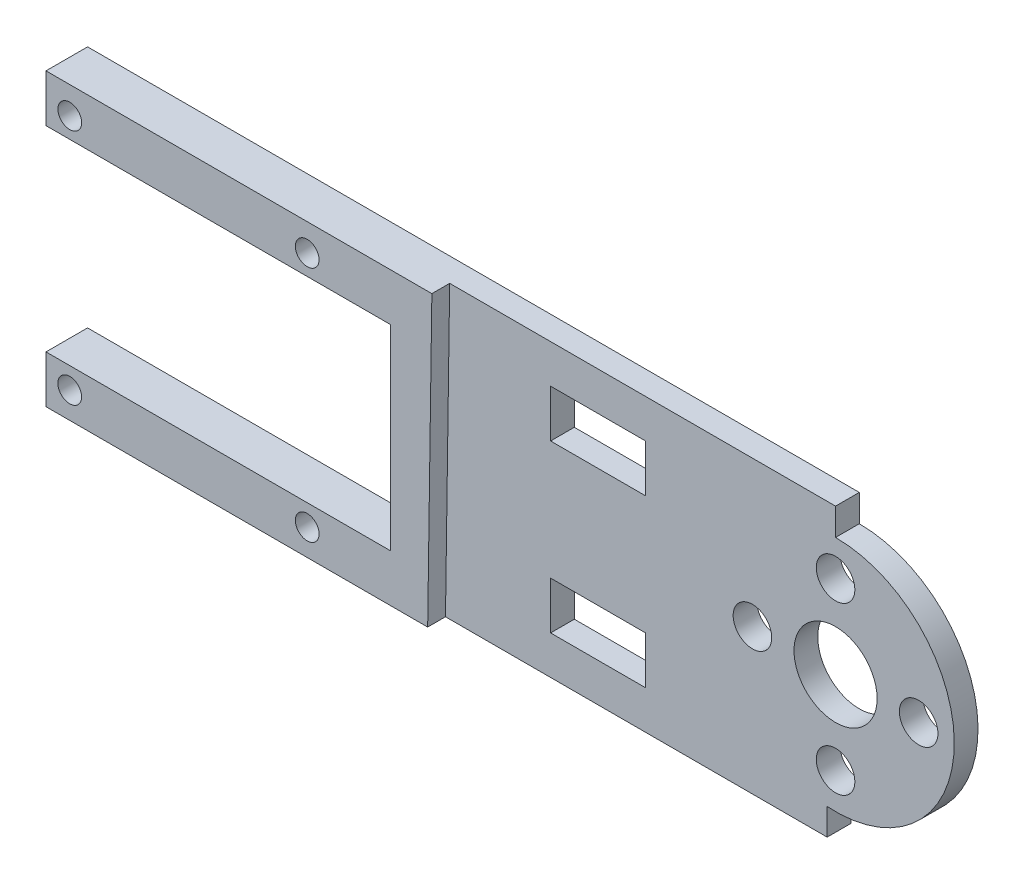
ISO-10303-21;
HEADER;
FILE_DESCRIPTION(('STEP AP214'),'2;1');
FILE_NAME('part.step','',(''),(''),'','','');
FILE_SCHEMA(('AUTOMOTIVE_DESIGN { 1 0 10303 214 1 1 1 1 }'));
ENDSEC;
DATA;
#1=APPLICATION_CONTEXT('core data for automotive mechanical design processes');
#2=APPLICATION_PROTOCOL_DEFINITION('international standard','automotive_design',2000,#1);
#3=PRODUCT_CONTEXT('',#1,'mechanical');
#4=PRODUCT('Part','Part','',(#3));
#5=PRODUCT_RELATED_PRODUCT_CATEGORY('part','',(#4));
#6=PRODUCT_DEFINITION_FORMATION('','',#4);
#7=PRODUCT_DEFINITION_CONTEXT('part definition',#1,'design');
#8=PRODUCT_DEFINITION('design','',#6,#7);
#9=PRODUCT_DEFINITION_SHAPE('','',#8);
#10=(LENGTH_UNIT() NAMED_UNIT(*) SI_UNIT(.MILLI.,.METRE.));
#11=(NAMED_UNIT(*) PLANE_ANGLE_UNIT() SI_UNIT($,.RADIAN.));
#12=(NAMED_UNIT(*) SI_UNIT($,.STERADIAN.) SOLID_ANGLE_UNIT());
#13=UNCERTAINTY_MEASURE_WITH_UNIT(LENGTH_MEASURE(1.E-05),#10,'distance_accuracy_value','');
#14=(GEOMETRIC_REPRESENTATION_CONTEXT(3) GLOBAL_UNCERTAINTY_ASSIGNED_CONTEXT((#13)) GLOBAL_UNIT_ASSIGNED_CONTEXT((#10,
#11,#12)) REPRESENTATION_CONTEXT('',''));
#15=CARTESIAN_POINT('',(0.,0.,0.));
#16=DIRECTION('',(0.,0.,1.));
#17=DIRECTION('',(1.,0.,0.));
#18=AXIS2_PLACEMENT_3D('',#15,#16,#17);
#19=CARTESIAN_POINT('',(40.1664390840958,-0.0357831339647865,2.));
#20=DIRECTION('',(0.,0.,1.));
#21=DIRECTION('',(1.,0.,0.));
#22=AXIS2_PLACEMENT_3D('',#19,#20,#21);
#23=PLANE('',#22);
#24=DIRECTION('',(0.0144240277608696,0.99989596830028,0.));
#25=VECTOR('',#24,1.);
#26=CARTESIAN_POINT('',(7.66643908409581,12.25,2.));
#27=LINE('',#26,#25);
#28=CARTESIAN_POINT('',(7.31301363650447,-12.25,2.));
#29=VERTEX_POINT('',#28);
#30=CARTESIAN_POINT('',(7.66643908409581,12.25,2.));
#31=VERTEX_POINT('',#30);
#32=EDGE_CURVE('E64',#29,#31,#27,.T.);
#33=ORIENTED_EDGE('',*,*,#32,.F.);
#34=DIRECTION('',(1.,0.,0.));
#35=VECTOR('',#34,1.);
#36=CARTESIAN_POINT('',(39.4595881889131,-12.25,2.));
#37=LINE('',#36,#35);
#38=CARTESIAN_POINT('',(39.4595881889131,-12.25,2.));
#39=VERTEX_POINT('',#38);
#40=EDGE_CURVE('E404',#29,#39,#37,.T.);
#41=ORIENTED_EDGE('',*,*,#40,.T.);
#42=DIRECTION('',(0.,1.,0.));
#43=VECTOR('',#42,1.);
#44=CARTESIAN_POINT('',(39.4595881889131,-10.0107699415741,2.));
#45=LINE('',#44,#43);
#46=CARTESIAN_POINT('',(39.4595881889131,-10.0107699415741,2.));
#47=VERTEX_POINT('',#46);
#48=EDGE_CURVE('E407',#39,#47,#45,.T.);
#49=ORIENTED_EDGE('',*,*,#48,.T.);
#50=CARTESIAN_POINT('',(40.1664390840958,-0.0357831339647865,2.));
#51=DIRECTION('',(0.,0.,1.));
#52=DIRECTION('',(1.,0.,0.));
#53=AXIS2_PLACEMENT_3D('',#50,#51,#52);
#54=CIRCLE('',#53,10.);
#55=CARTESIAN_POINT('',(40.1664390840958,9.96421686603521,2.));
#56=VERTEX_POINT('',#55);
#57=EDGE_CURVE('E413',#47,#56,#54,.T.);
#58=ORIENTED_EDGE('',*,*,#57,.T.);
#59=DIRECTION('',(0.,1.,0.));
#60=VECTOR('',#59,1.);
#61=CARTESIAN_POINT('',(40.1664390840958,12.25,2.));
#62=LINE('',#61,#60);
#63=CARTESIAN_POINT('',(40.1664390840958,12.25,2.));
#64=VERTEX_POINT('',#63);
#65=EDGE_CURVE('E415',#56,#64,#62,.T.);
#66=ORIENTED_EDGE('',*,*,#65,.T.);
#67=DIRECTION('',(-1.,0.,0.));
#68=VECTOR('',#67,1.);
#69=CARTESIAN_POINT('',(5.16643908409581,12.25,2.));
#70=LINE('',#69,#68);
#71=EDGE_CURVE('E417',#64,#31,#70,.T.);
#72=ORIENTED_EDGE('',*,*,#71,.T.);
#73=EDGE_LOOP('',(#33,#41,#49,#58,#66,#72));
#74=FACE_BOUND('',#73,.T.);
#75=CARTESIAN_POINT('',(40.1664390840958,-7.03578313396479,2.));
#76=DIRECTION('',(0.,0.,1.));
#77=DIRECTION('',(1.,0.,0.));
#78=AXIS2_PLACEMENT_3D('',#75,#76,#77);
#79=CIRCLE('',#78,1.625);
#80=CARTESIAN_POINT('',(41.7914390840958,-7.03578313396479,2.));
#81=VERTEX_POINT('',#80);
#82=EDGE_CURVE('E298',#81,#81,#79,.T.);
#83=ORIENTED_EDGE('',*,*,#82,.F.);
#84=EDGE_LOOP('',(#83));
#85=FACE_BOUND('',#84,.T.);
#86=DIRECTION('',(-1.,0.,0.));
#87=VECTOR('',#86,1.);
#88=CARTESIAN_POINT('',(16.1664710949383,9.,2.));
#89=LINE('',#88,#87);
#90=CARTESIAN_POINT('',(24.1664710949383,9.,2.));
#91=VERTEX_POINT('',#90);
#92=CARTESIAN_POINT('',(16.1664710949383,9.,2.));
#93=VERTEX_POINT('',#92);
#94=EDGE_CURVE('E318',#91,#93,#89,.T.);
#95=ORIENTED_EDGE('',*,*,#94,.F.);
#96=DIRECTION('',(0.,1.,0.));
#97=VECTOR('',#96,1.);
#98=CARTESIAN_POINT('',(24.1664710949383,9.,2.));
#99=LINE('',#98,#97);
#100=CARTESIAN_POINT('',(24.1664710949383,5.,2.));
#101=VERTEX_POINT('',#100);
#102=EDGE_CURVE('E312',#101,#91,#99,.T.);
#103=ORIENTED_EDGE('',*,*,#102,.F.);
#104=DIRECTION('',(1.,0.,0.));
#105=VECTOR('',#104,1.);
#106=CARTESIAN_POINT('',(16.1664710949383,5.,2.));
#107=LINE('',#106,#105);
#108=CARTESIAN_POINT('',(16.1664710949383,5.,2.));
#109=VERTEX_POINT('',#108);
#110=EDGE_CURVE('E326',#109,#101,#107,.T.);
#111=ORIENTED_EDGE('',*,*,#110,.F.);
#112=DIRECTION('',(0.,-1.,0.));
#113=VECTOR('',#112,1.);
#114=CARTESIAN_POINT('',(16.1664710949383,9.,2.));
#115=LINE('',#114,#113);
#116=EDGE_CURVE('E325',#93,#109,#115,.T.);
#117=ORIENTED_EDGE('',*,*,#116,.F.);
#118=EDGE_LOOP('',(#95,#103,#111,#117));
#119=FACE_BOUND('',#118,.T.);
#120=CARTESIAN_POINT('',(40.1664390840958,6.96421686603521,2.));
#121=DIRECTION('',(0.,0.,1.));
#122=DIRECTION('',(1.,0.,0.));
#123=AXIS2_PLACEMENT_3D('',#120,#121,#122);
#124=CIRCLE('',#123,1.625);
#125=CARTESIAN_POINT('',(41.7914390840958,6.96421686603521,2.));
#126=VERTEX_POINT('',#125);
#127=EDGE_CURVE('E357',#126,#126,#124,.T.);
#128=ORIENTED_EDGE('',*,*,#127,.F.);
#129=EDGE_LOOP('',(#128));
#130=FACE_BOUND('',#129,.T.);
#131=CARTESIAN_POINT('',(40.1664390840958,-0.0357831339647865,2.));
#132=DIRECTION('',(0.,0.,1.));
#133=DIRECTION('',(1.,0.,0.));
#134=AXIS2_PLACEMENT_3D('',#131,#132,#133);
#135=CIRCLE('',#134,3.5);
#136=CARTESIAN_POINT('',(43.6664390840958,-0.0357831339647865,2.));
#137=VERTEX_POINT('',#136);
#138=EDGE_CURVE('E368',#137,#137,#135,.T.);
#139=ORIENTED_EDGE('',*,*,#138,.F.);
#140=EDGE_LOOP('',(#139));
#141=FACE_BOUND('',#140,.T.);
#142=CARTESIAN_POINT('',(47.1664390840958,-0.0357831339647882,2.));
#143=DIRECTION('',(0.,0.,1.));
#144=DIRECTION('',(1.,0.,0.));
#145=AXIS2_PLACEMENT_3D('',#142,#143,#144);
#146=CIRCLE('',#145,1.625);
#147=CARTESIAN_POINT('',(48.7914390840958,-0.0357831339647882,2.));
#148=VERTEX_POINT('',#147);
#149=EDGE_CURVE('E307',#148,#148,#146,.T.);
#150=ORIENTED_EDGE('',*,*,#149,.F.);
#151=EDGE_LOOP('',(#150));
#152=FACE_BOUND('',#151,.T.);
#153=CARTESIAN_POINT('',(33.1664390840958,-0.0357831339647839,2.));
#154=DIRECTION('',(0.,0.,1.));
#155=DIRECTION('',(1.,0.,0.));
#156=AXIS2_PLACEMENT_3D('',#153,#154,#155);
#157=CIRCLE('',#156,1.625);
#158=CARTESIAN_POINT('',(34.7914390840958,-0.0357831339647839,2.));
#159=VERTEX_POINT('',#158);
#160=EDGE_CURVE('E292',#159,#159,#157,.T.);
#161=ORIENTED_EDGE('',*,*,#160,.F.);
#162=EDGE_LOOP('',(#161));
#163=FACE_BOUND('',#162,.T.);
#164=DIRECTION('',(-1.,0.,0.));
#165=VECTOR('',#164,1.);
#166=CARTESIAN_POINT('',(16.1664710949383,-5.,2.));
#167=LINE('',#166,#165);
#168=CARTESIAN_POINT('',(24.1664710949383,-5.,2.));
#169=VERTEX_POINT('',#168);
#170=CARTESIAN_POINT('',(16.1664710949383,-5.,2.));
#171=VERTEX_POINT('',#170);
#172=EDGE_CURVE('E253',#169,#171,#167,.T.);
#173=ORIENTED_EDGE('',*,*,#172,.F.);
#174=DIRECTION('',(0.,1.,0.));
#175=VECTOR('',#174,1.);
#176=CARTESIAN_POINT('',(24.1664710949383,-5.,2.));
#177=LINE('',#176,#175);
#178=CARTESIAN_POINT('',(24.1664710949383,-9.,2.));
#179=VERTEX_POINT('',#178);
#180=EDGE_CURVE('E247',#179,#169,#177,.T.);
#181=ORIENTED_EDGE('',*,*,#180,.F.);
#182=DIRECTION('',(1.,0.,0.));
#183=VECTOR('',#182,1.);
#184=CARTESIAN_POINT('',(16.1664710949383,-9.,2.));
#185=LINE('',#184,#183);
#186=CARTESIAN_POINT('',(16.1664710949383,-9.,2.));
#187=VERTEX_POINT('',#186);
#188=EDGE_CURVE('E256',#187,#179,#185,.T.);
#189=ORIENTED_EDGE('',*,*,#188,.F.);
#190=DIRECTION('',(0.,-1.,0.));
#191=VECTOR('',#190,1.);
#192=CARTESIAN_POINT('',(16.1664710949383,-5.,2.));
#193=LINE('',#192,#191);
#194=EDGE_CURVE('E254',#171,#187,#193,.T.);
#195=ORIENTED_EDGE('',*,*,#194,.F.);
#196=EDGE_LOOP('',(#173,#181,#189,#195));
#197=FACE_BOUND('',#196,.T.);
#198=ADVANCED_FACE('F44',(#74,#85,#119,#130,#141,#152,#163,#197),#23,.T.);
#199=CARTESIAN_POINT('',(40.1664390840958,-0.0357831339647865,0.));
#200=DIRECTION('',(0.,0.,1.));
#201=DIRECTION('',(1.,0.,0.));
#202=AXIS2_PLACEMENT_3D('',#199,#200,#201);
#203=PLANE('',#202);
#204=CARTESIAN_POINT('',(33.1664390840958,-0.0357831339647839,0.));
#205=DIRECTION('',(0.,0.,1.));
#206=DIRECTION('',(1.,0.,0.));
#207=AXIS2_PLACEMENT_3D('',#204,#205,#206);
#208=CIRCLE('',#207,1.625);
#209=CARTESIAN_POINT('',(34.7914390840958,-0.0357831339647839,0.));
#210=VERTEX_POINT('',#209);
#211=EDGE_CURVE('E286',#210,#210,#208,.T.);
#212=ORIENTED_EDGE('',*,*,#211,.T.);
#213=EDGE_LOOP('',(#212));
#214=FACE_BOUND('',#213,.T.);
#215=CARTESIAN_POINT('',(40.1664390840958,-7.03578313396479,0.));
#216=DIRECTION('',(0.,0.,1.));
#217=DIRECTION('',(1.,0.,0.));
#218=AXIS2_PLACEMENT_3D('',#215,#216,#217);
#219=CIRCLE('',#218,1.625);
#220=CARTESIAN_POINT('',(41.7914390840958,-7.03578313396479,0.));
#221=VERTEX_POINT('',#220);
#222=EDGE_CURVE('E293',#221,#221,#219,.T.);
#223=ORIENTED_EDGE('',*,*,#222,.T.);
#224=EDGE_LOOP('',(#223));
#225=FACE_BOUND('',#224,.T.);
#226=CARTESIAN_POINT('',(47.1664390840958,-0.0357831339647882,0.));
#227=DIRECTION('',(0.,0.,1.));
#228=DIRECTION('',(1.,0.,0.));
#229=AXIS2_PLACEMENT_3D('',#226,#227,#228);
#230=CIRCLE('',#229,1.625);
#231=CARTESIAN_POINT('',(48.7914390840958,-0.0357831339647882,0.));
#232=VERTEX_POINT('',#231);
#233=EDGE_CURVE('E302',#232,#232,#230,.T.);
#234=ORIENTED_EDGE('',*,*,#233,.T.);
#235=EDGE_LOOP('',(#234));
#236=FACE_BOUND('',#235,.T.);
#237=DIRECTION('',(0.,1.,0.));
#238=VECTOR('',#237,1.);
#239=CARTESIAN_POINT('',(24.1664710949383,9.,0.));
#240=LINE('',#239,#238);
#241=CARTESIAN_POINT('',(24.1664710949383,5.,0.));
#242=VERTEX_POINT('',#241);
#243=CARTESIAN_POINT('',(24.1664710949383,9.,0.));
#244=VERTEX_POINT('',#243);
#245=EDGE_CURVE('E313',#242,#244,#240,.T.);
#246=ORIENTED_EDGE('',*,*,#245,.T.);
#247=DIRECTION('',(-1.,0.,0.));
#248=VECTOR('',#247,1.);
#249=CARTESIAN_POINT('',(16.1664710949383,9.,0.));
#250=LINE('',#249,#248);
#251=CARTESIAN_POINT('',(16.1664710949383,9.,0.));
#252=VERTEX_POINT('',#251);
#253=EDGE_CURVE('E334',#244,#252,#250,.T.);
#254=ORIENTED_EDGE('',*,*,#253,.T.);
#255=DIRECTION('',(0.,-1.,0.));
#256=VECTOR('',#255,1.);
#257=CARTESIAN_POINT('',(16.1664710949383,9.,0.));
#258=LINE('',#257,#256);
#259=CARTESIAN_POINT('',(16.1664710949383,5.,0.));
#260=VERTEX_POINT('',#259);
#261=EDGE_CURVE('E337',#252,#260,#258,.T.);
#262=ORIENTED_EDGE('',*,*,#261,.T.);
#263=DIRECTION('',(1.,0.,0.));
#264=VECTOR('',#263,1.);
#265=CARTESIAN_POINT('',(16.1664710949383,5.,0.));
#266=LINE('',#265,#264);
#267=EDGE_CURVE('E317',#260,#242,#266,.T.);
#268=ORIENTED_EDGE('',*,*,#267,.T.);
#269=EDGE_LOOP('',(#246,#254,#262,#268));
#270=FACE_BOUND('',#269,.T.);
#271=DIRECTION('',(0.,1.,0.));
#272=VECTOR('',#271,1.);
#273=CARTESIAN_POINT('',(39.4595881889131,-10.0107699415741,0.));
#274=LINE('',#273,#272);
#275=CARTESIAN_POINT('',(39.4595881889131,-12.25,0.));
#276=VERTEX_POINT('',#275);
#277=CARTESIAN_POINT('',(39.4595881889131,-10.0107699415741,0.));
#278=VERTEX_POINT('',#277);
#279=EDGE_CURVE('E401',#276,#278,#274,.T.);
#280=ORIENTED_EDGE('',*,*,#279,.F.);
#281=DIRECTION('',(1.,0.,0.));
#282=VECTOR('',#281,1.);
#283=CARTESIAN_POINT('',(-4.83356091590419,-12.25,0.));
#284=LINE('',#283,#282);
#285=CARTESIAN_POINT('',(-24.8335609159042,-12.25,0.));
#286=VERTEX_POINT('',#285);
#287=EDGE_CURVE('E409',#286,#276,#284,.T.);
#288=ORIENTED_EDGE('',*,*,#287,.F.);
#289=DIRECTION('',(0.,-1.,0.));
#290=VECTOR('',#289,1.);
#291=CARTESIAN_POINT('',(-24.8335609159042,-8.25,0.));
#292=LINE('',#291,#290);
#293=CARTESIAN_POINT('',(-24.8335609159042,-8.25,0.));
#294=VERTEX_POINT('',#293);
#295=EDGE_CURVE('E441',#294,#286,#292,.T.);
#296=ORIENTED_EDGE('',*,*,#295,.F.);
#297=DIRECTION('',(-1.,0.,0.));
#298=VECTOR('',#297,1.);
#299=CARTESIAN_POINT('',(4.16643908409582,-8.25,0.));
#300=LINE('',#299,#298);
#301=CARTESIAN_POINT('',(4.16643908409582,-8.25,0.));
#302=VERTEX_POINT('',#301);
#303=EDGE_CURVE('E442',#302,#294,#300,.T.);
#304=ORIENTED_EDGE('',*,*,#303,.F.);
#305=DIRECTION('',(0.,-1.,0.));
#306=VECTOR('',#305,1.);
#307=CARTESIAN_POINT('',(4.16643908409582,8.25,0.));
#308=LINE('',#307,#306);
#309=CARTESIAN_POINT('',(4.16643908409582,8.25,0.));
#310=VERTEX_POINT('',#309);
#311=EDGE_CURVE('E437',#310,#302,#308,.T.);
#312=ORIENTED_EDGE('',*,*,#311,.F.);
#313=DIRECTION('',(1.,0.,0.));
#314=VECTOR('',#313,1.);
#315=CARTESIAN_POINT('',(-24.8335609159042,8.24999999999999,0.));
#316=LINE('',#315,#314);
#317=CARTESIAN_POINT('',(-24.8335609159042,8.24999999999999,0.));
#318=VERTEX_POINT('',#317);
#319=EDGE_CURVE('E434',#318,#310,#316,.T.);
#320=ORIENTED_EDGE('',*,*,#319,.F.);
#321=DIRECTION('',(0.,-1.,0.));
#322=VECTOR('',#321,1.);
#323=CARTESIAN_POINT('',(-24.8335609159042,12.25,0.));
#324=LINE('',#323,#322);
#325=CARTESIAN_POINT('',(-24.8335609159042,12.25,0.));
#326=VERTEX_POINT('',#325);
#327=EDGE_CURVE('E194',#326,#318,#324,.T.);
#328=ORIENTED_EDGE('',*,*,#327,.F.);
#329=DIRECTION('',(-1.,0.,0.));
#330=VECTOR('',#329,1.);
#331=CARTESIAN_POINT('',(-4.83356091590419,12.25,0.));
#332=LINE('',#331,#330);
#333=CARTESIAN_POINT('',(40.1664390840958,12.25,0.));
#334=VERTEX_POINT('',#333);
#335=EDGE_CURVE('E429',#334,#326,#332,.T.);
#336=ORIENTED_EDGE('',*,*,#335,.F.);
#337=DIRECTION('',(0.,1.,0.));
#338=VECTOR('',#337,1.);
#339=CARTESIAN_POINT('',(40.1664390840958,12.25,0.));
#340=LINE('',#339,#338);
#341=CARTESIAN_POINT('',(40.1664390840958,9.96421686603521,0.));
#342=VERTEX_POINT('',#341);
#343=EDGE_CURVE('E426',#342,#334,#340,.T.);
#344=ORIENTED_EDGE('',*,*,#343,.F.);
#345=CARTESIAN_POINT('',(40.1664390840958,-0.0357831339647865,0.));
#346=DIRECTION('',(0.,0.,1.));
#347=DIRECTION('',(1.,0.,0.));
#348=AXIS2_PLACEMENT_3D('',#345,#346,#347);
#349=CIRCLE('',#348,10.);
#350=EDGE_CURVE('E421',#278,#342,#349,.T.);
#351=ORIENTED_EDGE('',*,*,#350,.F.);
#352=EDGE_LOOP('',(#280,#288,#296,#304,#312,#320,#328,#336,#344,#351));
#353=FACE_BOUND('',#352,.T.);
#354=CARTESIAN_POINT('',(-2.83356091590418,9.96421686603521,0.));
#355=DIRECTION('',(0.,0.,1.));
#356=DIRECTION('',(1.,0.,0.));
#357=AXIS2_PLACEMENT_3D('',#354,#355,#356);
#358=CIRCLE('',#357,1.125);
#359=CARTESIAN_POINT('',(-1.70856091590418,9.96421686603521,0.));
#360=VERTEX_POINT('',#359);
#361=EDGE_CURVE('E398',#360,#360,#358,.T.);
#362=ORIENTED_EDGE('',*,*,#361,.T.);
#363=EDGE_LOOP('',(#362));
#364=FACE_BOUND('',#363,.T.);
#365=CARTESIAN_POINT('',(-2.83356091590418,-10.0357831339648,0.));
#366=DIRECTION('',(0.,0.,1.));
#367=DIRECTION('',(1.,0.,0.));
#368=AXIS2_PLACEMENT_3D('',#365,#366,#367);
#369=CIRCLE('',#368,1.125);
#370=CARTESIAN_POINT('',(-1.70856091590418,-10.0357831339648,0.));
#371=VERTEX_POINT('',#370);
#372=EDGE_CURVE('E386',#371,#371,#369,.T.);
#373=ORIENTED_EDGE('',*,*,#372,.T.);
#374=EDGE_LOOP('',(#373));
#375=FACE_BOUND('',#374,.T.);
#376=CARTESIAN_POINT('',(-22.8335609159042,9.96421686603521,0.));
#377=DIRECTION('',(0.,0.,1.));
#378=DIRECTION('',(1.,0.,0.));
#379=AXIS2_PLACEMENT_3D('',#376,#377,#378);
#380=CIRCLE('',#379,1.125);
#381=CARTESIAN_POINT('',(-21.7085609159042,9.96421686603521,0.));
#382=VERTEX_POINT('',#381);
#383=EDGE_CURVE('E381',#382,#382,#380,.T.);
#384=ORIENTED_EDGE('',*,*,#383,.T.);
#385=EDGE_LOOP('',(#384));
#386=FACE_BOUND('',#385,.T.);
#387=CARTESIAN_POINT('',(-22.8335609159042,-10.0357831339648,0.));
#388=DIRECTION('',(0.,0.,1.));
#389=DIRECTION('',(1.,0.,0.));
#390=AXIS2_PLACEMENT_3D('',#387,#388,#389);
#391=CIRCLE('',#390,1.125);
#392=CARTESIAN_POINT('',(-21.7085609159042,-10.0357831339648,0.));
#393=VERTEX_POINT('',#392);
#394=EDGE_CURVE('E367',#393,#393,#391,.T.);
#395=ORIENTED_EDGE('',*,*,#394,.T.);
#396=EDGE_LOOP('',(#395));
#397=FACE_BOUND('',#396,.T.);
#398=CARTESIAN_POINT('',(40.1664390840958,-0.0357831339647865,0.));
#399=DIRECTION('',(0.,0.,1.));
#400=DIRECTION('',(1.,0.,0.));
#401=AXIS2_PLACEMENT_3D('',#398,#399,#400);
#402=CIRCLE('',#401,3.5);
#403=CARTESIAN_POINT('',(43.6664390840958,-0.0357831339647865,0.));
#404=VERTEX_POINT('',#403);
#405=EDGE_CURVE('E362',#404,#404,#402,.T.);
#406=ORIENTED_EDGE('',*,*,#405,.T.);
#407=EDGE_LOOP('',(#406));
#408=FACE_BOUND('',#407,.T.);
#409=CARTESIAN_POINT('',(40.1664390840958,6.96421686603521,0.));
#410=DIRECTION('',(0.,0.,1.));
#411=DIRECTION('',(1.,0.,0.));
#412=AXIS2_PLACEMENT_3D('',#409,#410,#411);
#413=CIRCLE('',#412,1.625);
#414=CARTESIAN_POINT('',(41.7914390840958,6.96421686603521,0.));
#415=VERTEX_POINT('',#414);
#416=EDGE_CURVE('E359',#415,#415,#413,.T.);
#417=ORIENTED_EDGE('',*,*,#416,.T.);
#418=EDGE_LOOP('',(#417));
#419=FACE_BOUND('',#418,.T.);
#420=DIRECTION('',(0.,1.,0.));
#421=VECTOR('',#420,1.);
#422=CARTESIAN_POINT('',(24.1664710949383,-5.,0.));
#423=LINE('',#422,#421);
#424=CARTESIAN_POINT('',(24.1664710949383,-9.,0.));
#425=VERTEX_POINT('',#424);
#426=CARTESIAN_POINT('',(24.1664710949383,-5.,0.));
#427=VERTEX_POINT('',#426);
#428=EDGE_CURVE('E265',#425,#427,#423,.T.);
#429=ORIENTED_EDGE('',*,*,#428,.T.);
#430=DIRECTION('',(-1.,0.,0.));
#431=VECTOR('',#430,1.);
#432=CARTESIAN_POINT('',(16.1664710949383,-5.,0.));
#433=LINE('',#432,#431);
#434=CARTESIAN_POINT('',(16.1664710949383,-5.,0.));
#435=VERTEX_POINT('',#434);
#436=EDGE_CURVE('E266',#427,#435,#433,.T.);
#437=ORIENTED_EDGE('',*,*,#436,.T.);
#438=DIRECTION('',(0.,-1.,0.));
#439=VECTOR('',#438,1.);
#440=CARTESIAN_POINT('',(16.1664710949383,-5.,0.));
#441=LINE('',#440,#439);
#442=CARTESIAN_POINT('',(16.1664710949383,-9.,0.));
#443=VERTEX_POINT('',#442);
#444=EDGE_CURVE('E271',#435,#443,#441,.T.);
#445=ORIENTED_EDGE('',*,*,#444,.T.);
#446=DIRECTION('',(1.,0.,0.));
#447=VECTOR('',#446,1.);
#448=CARTESIAN_POINT('',(16.1664710949383,-9.,0.));
#449=LINE('',#448,#447);
#450=EDGE_CURVE('E252',#443,#425,#449,.T.);
#451=ORIENTED_EDGE('',*,*,#450,.T.);
#452=EDGE_LOOP('',(#429,#437,#445,#451));
#453=FACE_BOUND('',#452,.T.);
#454=ADVANCED_FACE('F515',(#214,#225,#236,#270,#353,#364,#375,#386,#397,#408,#419,#453),#203,.F.);
#455=CARTESIAN_POINT('',(39.4595881889131,-10.0107699415741,2.));
#456=DIRECTION('',(-1.,0.,0.));
#457=DIRECTION('',(0.,0.,1.));
#458=AXIS2_PLACEMENT_3D('',#455,#456,#457);
#459=PLANE('',#458);
#460=ORIENTED_EDGE('',*,*,#279,.T.);
#461=DIRECTION('',(0.,0.,-1.));
#462=VECTOR('',#461,1.);
#463=CARTESIAN_POINT('',(39.4595881889131,-10.0107699415741,2.));
#464=LINE('',#463,#462);
#465=EDGE_CURVE('E54',#47,#278,#464,.T.);
#466=ORIENTED_EDGE('',*,*,#465,.F.);
#467=ORIENTED_EDGE('',*,*,#48,.F.);
#468=DIRECTION('',(0.,0.,-1.));
#469=VECTOR('',#468,1.);
#470=CARTESIAN_POINT('',(39.4595881889131,-12.25,2.));
#471=LINE('',#470,#469);
#472=EDGE_CURVE('E11',#39,#276,#471,.T.);
#473=ORIENTED_EDGE('',*,*,#472,.T.);
#474=EDGE_LOOP('',(#460,#466,#467,#473));
#475=FACE_BOUND('',#474,.T.);
#476=ADVANCED_FACE('F50',(#475),#459,.F.);
#477=CARTESIAN_POINT('',(40.1664390840958,-0.0357831339647865,2.));
#478=DIRECTION('',(0.,0.,-1.));
#479=DIRECTION('',(-1.,0.,0.));
#480=AXIS2_PLACEMENT_3D('',#477,#478,#479);
#481=CYLINDRICAL_SURFACE('',#480,10.);
#482=ORIENTED_EDGE('',*,*,#350,.T.);
#483=DIRECTION('',(0.,0.,-1.));
#484=VECTOR('',#483,1.);
#485=CARTESIAN_POINT('',(40.1664390840958,9.96421686603521,2.));
#486=LINE('',#485,#484);
#487=EDGE_CURVE('E470',#56,#342,#486,.T.);
#488=ORIENTED_EDGE('',*,*,#487,.F.);
#489=ORIENTED_EDGE('',*,*,#57,.F.);
#490=ORIENTED_EDGE('',*,*,#465,.T.);
#491=EDGE_LOOP('',(#482,#488,#489,#490));
#492=FACE_BOUND('',#491,.T.);
#493=ADVANCED_FACE('F582',(#492),#481,.T.);
#494=CARTESIAN_POINT('',(40.1664390840958,12.25,2.));
#495=DIRECTION('',(-1.,0.,0.));
#496=DIRECTION('',(0.,0.,1.));
#497=AXIS2_PLACEMENT_3D('',#494,#495,#496);
#498=PLANE('',#497);
#499=ORIENTED_EDGE('',*,*,#343,.T.);
#500=DIRECTION('',(0.,0.,-1.));
#501=VECTOR('',#500,1.);
#502=CARTESIAN_POINT('',(40.1664390840958,12.25,2.));
#503=LINE('',#502,#501);
#504=EDGE_CURVE('E465',#64,#334,#503,.T.);
#505=ORIENTED_EDGE('',*,*,#504,.F.);
#506=ORIENTED_EDGE('',*,*,#65,.F.);
#507=ORIENTED_EDGE('',*,*,#487,.T.);
#508=EDGE_LOOP('',(#499,#505,#506,#507));
#509=FACE_BOUND('',#508,.T.);
#510=ADVANCED_FACE('F580',(#509),#498,.F.);
#511=CARTESIAN_POINT('',(-4.83356091590419,12.25,2.));
#512=DIRECTION('',(0.,-1.,0.));
#513=DIRECTION('',(1.,0.,0.));
#514=AXIS2_PLACEMENT_3D('',#511,#512,#513);
#515=PLANE('',#514);
#516=ORIENTED_EDGE('',*,*,#335,.T.);
#517=DIRECTION('',(0.,0.,-1.));
#518=VECTOR('',#517,1.);
#519=CARTESIAN_POINT('',(-24.8335609159042,12.25,2.));
#520=LINE('',#519,#518);
#521=CARTESIAN_POINT('',(-24.8335609159042,12.25,3.5));
#522=VERTEX_POINT('',#521);
#523=EDGE_CURVE('E198',#522,#326,#520,.T.);
#524=ORIENTED_EDGE('',*,*,#523,.F.);
#525=DIRECTION('',(-1.,0.,0.));
#526=VECTOR('',#525,1.);
#527=CARTESIAN_POINT('',(-24.8335609159042,12.25,3.5));
#528=LINE('',#527,#526);
#529=CARTESIAN_POINT('',(7.66643908409581,12.25,3.5));
#530=VERTEX_POINT('',#529);
#531=EDGE_CURVE('E215',#530,#522,#528,.T.);
#532=ORIENTED_EDGE('',*,*,#531,.F.);
#533=DIRECTION('',(0.,0.,-1.));
#534=VECTOR('',#533,1.);
#535=CARTESIAN_POINT('',(7.66643908409581,12.25,3.5));
#536=LINE('',#535,#534);
#537=EDGE_CURVE('E236',#530,#31,#536,.T.);
#538=ORIENTED_EDGE('',*,*,#537,.T.);
#539=ORIENTED_EDGE('',*,*,#71,.F.);
#540=ORIENTED_EDGE('',*,*,#504,.T.);
#541=EDGE_LOOP('',(#516,#524,#532,#538,#539,#540));
#542=FACE_BOUND('',#541,.T.);
#543=ADVANCED_FACE('F579',(#542),#515,.F.);
#544=CARTESIAN_POINT('',(-24.8335609159042,12.25,2.));
#545=DIRECTION('',(1.,0.,0.));
#546=DIRECTION('',(0.,0.,-1.));
#547=AXIS2_PLACEMENT_3D('',#544,#545,#546);
#548=PLANE('',#547);
#549=ORIENTED_EDGE('',*,*,#327,.T.);
#550=DIRECTION('',(0.,0.,-1.));
#551=VECTOR('',#550,1.);
#552=CARTESIAN_POINT('',(-24.8335609159042,8.24999999999999,2.));
#553=LINE('',#552,#551);
#554=CARTESIAN_POINT('',(-24.8335609159042,8.24999999999999,3.5));
#555=VERTEX_POINT('',#554);
#556=EDGE_CURVE('E183',#555,#318,#553,.T.);
#557=ORIENTED_EDGE('',*,*,#556,.F.);
#558=DIRECTION('',(0.,-1.,0.));
#559=VECTOR('',#558,1.);
#560=CARTESIAN_POINT('',(-24.8335609159042,8.24999999999999,3.5));
#561=LINE('',#560,#559);
#562=EDGE_CURVE('E190',#522,#555,#561,.T.);
#563=ORIENTED_EDGE('',*,*,#562,.F.);
#564=ORIENTED_EDGE('',*,*,#523,.T.);
#565=EDGE_LOOP('',(#549,#557,#563,#564));
#566=FACE_BOUND('',#565,.T.);
#567=ADVANCED_FACE('F187',(#566),#548,.F.);
#568=CARTESIAN_POINT('',(-24.8335609159042,8.24999999999999,2.));
#569=DIRECTION('',(0.,1.,0.));
#570=DIRECTION('',(-1.,0.,0.));
#571=AXIS2_PLACEMENT_3D('',#568,#569,#570);
#572=PLANE('',#571);
#573=ORIENTED_EDGE('',*,*,#319,.T.);
#574=DIRECTION('',(0.,0.,-1.));
#575=VECTOR('',#574,1.);
#576=CARTESIAN_POINT('',(4.16643908409582,8.25,2.));
#577=LINE('',#576,#575);
#578=CARTESIAN_POINT('',(4.16643908409582,8.25,3.5));
#579=VERTEX_POINT('',#578);
#580=EDGE_CURVE('E197',#579,#310,#577,.T.);
#581=ORIENTED_EDGE('',*,*,#580,.F.);
#582=DIRECTION('',(1.,0.,0.));
#583=VECTOR('',#582,1.);
#584=CARTESIAN_POINT('',(4.16643908409582,8.25,3.5));
#585=LINE('',#584,#583);
#586=EDGE_CURVE('E199',#555,#579,#585,.T.);
#587=ORIENTED_EDGE('',*,*,#586,.F.);
#588=ORIENTED_EDGE('',*,*,#556,.T.);
#589=EDGE_LOOP('',(#573,#581,#587,#588));
#590=FACE_BOUND('',#589,.T.);
#591=ADVANCED_FACE('F203',(#590),#572,.F.);
#592=CARTESIAN_POINT('',(4.16643908409582,8.25,2.));
#593=DIRECTION('',(1.,0.,0.));
#594=DIRECTION('',(0.,1.,0.));
#595=AXIS2_PLACEMENT_3D('',#592,#593,#594);
#596=PLANE('',#595);
#597=ORIENTED_EDGE('',*,*,#311,.T.);
#598=DIRECTION('',(0.,0.,-1.));
#599=VECTOR('',#598,1.);
#600=CARTESIAN_POINT('',(4.16643908409582,-8.25,2.));
#601=LINE('',#600,#599);
#602=CARTESIAN_POINT('',(4.16643908409582,-8.25,3.5));
#603=VERTEX_POINT('',#602);
#604=EDGE_CURVE('E460',#603,#302,#601,.T.);
#605=ORIENTED_EDGE('',*,*,#604,.F.);
#606=DIRECTION('',(0.,-1.,0.));
#607=VECTOR('',#606,1.);
#608=CARTESIAN_POINT('',(4.16643908409582,-8.25,3.5));
#609=LINE('',#608,#607);
#610=EDGE_CURVE('E210',#579,#603,#609,.T.);
#611=ORIENTED_EDGE('',*,*,#610,.F.);
#612=ORIENTED_EDGE('',*,*,#580,.T.);
#613=EDGE_LOOP('',(#597,#605,#611,#612));
#614=FACE_BOUND('',#613,.T.);
#615=ADVANCED_FACE('F566',(#614),#596,.F.);
#616=CARTESIAN_POINT('',(4.16643908409582,-8.25,2.));
#617=DIRECTION('',(0.,-1.,0.));
#618=DIRECTION('',(1.,0.,0.));
#619=AXIS2_PLACEMENT_3D('',#616,#617,#618);
#620=PLANE('',#619);
#621=ORIENTED_EDGE('',*,*,#303,.T.);
#622=DIRECTION('',(0.,0.,-1.));
#623=VECTOR('',#622,1.);
#624=CARTESIAN_POINT('',(-24.8335609159042,-8.25,2.));
#625=LINE('',#624,#623);
#626=CARTESIAN_POINT('',(-24.8335609159042,-8.25,3.5));
#627=VERTEX_POINT('',#626);
#628=EDGE_CURVE('E452',#627,#294,#625,.T.);
#629=ORIENTED_EDGE('',*,*,#628,.F.);
#630=DIRECTION('',(-1.,0.,0.));
#631=VECTOR('',#630,1.);
#632=CARTESIAN_POINT('',(-24.8335609159042,-8.25,3.5));
#633=LINE('',#632,#631);
#634=EDGE_CURVE('E224',#603,#627,#633,.T.);
#635=ORIENTED_EDGE('',*,*,#634,.F.);
#636=ORIENTED_EDGE('',*,*,#604,.T.);
#637=EDGE_LOOP('',(#621,#629,#635,#636));
#638=FACE_BOUND('',#637,.T.);
#639=ADVANCED_FACE('F565',(#638),#620,.F.);
#640=CARTESIAN_POINT('',(-24.8335609159042,-8.25,2.));
#641=DIRECTION('',(1.,0.,0.));
#642=DIRECTION('',(0.,0.,-1.));
#643=AXIS2_PLACEMENT_3D('',#640,#641,#642);
#644=PLANE('',#643);
#645=ORIENTED_EDGE('',*,*,#295,.T.);
#646=DIRECTION('',(0.,0.,-1.));
#647=VECTOR('',#646,1.);
#648=CARTESIAN_POINT('',(-24.8335609159042,-12.25,2.));
#649=LINE('',#648,#647);
#650=CARTESIAN_POINT('',(-24.8335609159042,-12.25,3.5));
#651=VERTEX_POINT('',#650);
#652=EDGE_CURVE('E419',#651,#286,#649,.T.);
#653=ORIENTED_EDGE('',*,*,#652,.F.);
#654=DIRECTION('',(0.,-1.,0.));
#655=VECTOR('',#654,1.);
#656=CARTESIAN_POINT('',(-24.8335609159042,-12.25,3.5));
#657=LINE('',#656,#655);
#658=EDGE_CURVE('E227',#627,#651,#657,.T.);
#659=ORIENTED_EDGE('',*,*,#658,.F.);
#660=ORIENTED_EDGE('',*,*,#628,.T.);
#661=EDGE_LOOP('',(#645,#653,#659,#660));
#662=FACE_BOUND('',#661,.T.);
#663=ADVANCED_FACE('F560',(#662),#644,.F.);
#664=CARTESIAN_POINT('',(-4.83356091590419,-12.25,2.));
#665=DIRECTION('',(0.,1.,0.));
#666=DIRECTION('',(0.,0.,1.));
#667=AXIS2_PLACEMENT_3D('',#664,#665,#666);
#668=PLANE('',#667);
#669=ORIENTED_EDGE('',*,*,#287,.T.);
#670=ORIENTED_EDGE('',*,*,#472,.F.);
#671=ORIENTED_EDGE('',*,*,#40,.F.);
#672=DIRECTION('',(0.,0.,-1.));
#673=VECTOR('',#672,1.);
#674=CARTESIAN_POINT('',(7.31301363650447,-12.25,3.5));
#675=LINE('',#674,#673);
#676=CARTESIAN_POINT('',(7.31301363650447,-12.25,3.5));
#677=VERTEX_POINT('',#676);
#678=EDGE_CURVE('E244',#677,#29,#675,.T.);
#679=ORIENTED_EDGE('',*,*,#678,.F.);
#680=DIRECTION('',(1.,0.,0.));
#681=VECTOR('',#680,1.);
#682=CARTESIAN_POINT('',(7.31301363650447,-12.25,3.5));
#683=LINE('',#682,#681);
#684=EDGE_CURVE('E233',#651,#677,#683,.T.);
#685=ORIENTED_EDGE('',*,*,#684,.F.);
#686=ORIENTED_EDGE('',*,*,#652,.T.);
#687=EDGE_LOOP('',(#669,#670,#671,#679,#685,#686));
#688=FACE_BOUND('',#687,.T.);
#689=ADVANCED_FACE('F557',(#688),#668,.F.);
#690=CARTESIAN_POINT('',(-2.83356091590418,9.96421686603521,2.));
#691=DIRECTION('',(0.,0.,-1.));
#692=DIRECTION('',(-1.,0.,0.));
#693=AXIS2_PLACEMENT_3D('',#690,#691,#692);
#694=CYLINDRICAL_SURFACE('',#693,1.125);
#695=CARTESIAN_POINT('',(-2.83356091590418,9.96421686603521,2.));
#696=DIRECTION('',(0.,0.,1.));
#697=DIRECTION('',(1.,0.,0.));
#698=AXIS2_PLACEMENT_3D('',#695,#696,#697);
#699=CIRCLE('',#698,1.125);
#700=CARTESIAN_POINT('',(-1.70856091590418,9.96421686603521,2.));
#701=VERTEX_POINT('',#700);
#702=EDGE_CURVE('E384',#701,#701,#699,.T.);
#703=ORIENTED_EDGE('',*,*,#702,.T.);
#704=EDGE_LOOP('',(#703));
#705=FACE_BOUND('',#704,.T.);
#706=ORIENTED_EDGE('',*,*,#361,.F.);
#707=EDGE_LOOP('',(#706));
#708=FACE_BOUND('',#707,.T.);
#709=ADVANCED_FACE('F551',(#705,#708),#694,.F.);
#710=CARTESIAN_POINT('',(-2.83356091590418,-10.0357831339648,2.));
#711=DIRECTION('',(0.,0.,-1.));
#712=DIRECTION('',(-1.,0.,0.));
#713=AXIS2_PLACEMENT_3D('',#710,#711,#712);
#714=CYLINDRICAL_SURFACE('',#713,1.125);
#715=CARTESIAN_POINT('',(-2.83356091590418,-10.0357831339648,2.));
#716=DIRECTION('',(0.,0.,1.));
#717=DIRECTION('',(1.,0.,0.));
#718=AXIS2_PLACEMENT_3D('',#715,#716,#717);
#719=CIRCLE('',#718,1.125);
#720=CARTESIAN_POINT('',(-1.70856091590418,-10.0357831339648,2.));
#721=VERTEX_POINT('',#720);
#722=EDGE_CURVE('E380',#721,#721,#719,.T.);
#723=ORIENTED_EDGE('',*,*,#722,.T.);
#724=EDGE_LOOP('',(#723));
#725=FACE_BOUND('',#724,.T.);
#726=ORIENTED_EDGE('',*,*,#372,.F.);
#727=EDGE_LOOP('',(#726));
#728=FACE_BOUND('',#727,.T.);
#729=ADVANCED_FACE('F507',(#725,#728),#714,.F.);
#730=CARTESIAN_POINT('',(-22.8335609159042,9.96421686603521,2.));
#731=DIRECTION('',(0.,0.,-1.));
#732=DIRECTION('',(-1.,0.,0.));
#733=AXIS2_PLACEMENT_3D('',#730,#731,#732);
#734=CYLINDRICAL_SURFACE('',#733,1.125);
#735=CARTESIAN_POINT('',(-22.8335609159042,9.96421686603521,2.));
#736=DIRECTION('',(0.,0.,1.));
#737=DIRECTION('',(1.,0.,0.));
#738=AXIS2_PLACEMENT_3D('',#735,#736,#737);
#739=CIRCLE('',#738,1.125);
#740=CARTESIAN_POINT('',(-21.7085609159042,9.96421686603521,2.));
#741=VERTEX_POINT('',#740);
#742=EDGE_CURVE('E249',#741,#741,#739,.T.);
#743=ORIENTED_EDGE('',*,*,#742,.T.);
#744=EDGE_LOOP('',(#743));
#745=FACE_BOUND('',#744,.T.);
#746=ORIENTED_EDGE('',*,*,#383,.F.);
#747=EDGE_LOOP('',(#746));
#748=FACE_BOUND('',#747,.T.);
#749=ADVANCED_FACE('F503',(#745,#748),#734,.F.);
#750=CARTESIAN_POINT('',(-22.8335609159042,-10.0357831339648,2.));
#751=DIRECTION('',(0.,0.,-1.));
#752=DIRECTION('',(-1.,0.,0.));
#753=AXIS2_PLACEMENT_3D('',#750,#751,#752);
#754=CYLINDRICAL_SURFACE('',#753,1.125);
#755=CARTESIAN_POINT('',(-22.8335609159042,-10.0357831339648,2.));
#756=DIRECTION('',(0.,0.,1.));
#757=DIRECTION('',(1.,0.,0.));
#758=AXIS2_PLACEMENT_3D('',#755,#756,#757);
#759=CIRCLE('',#758,1.125);
#760=CARTESIAN_POINT('',(-21.7085609159042,-10.0357831339648,2.));
#761=VERTEX_POINT('',#760);
#762=EDGE_CURVE('E270',#761,#761,#759,.T.);
#763=ORIENTED_EDGE('',*,*,#762,.T.);
#764=EDGE_LOOP('',(#763));
#765=FACE_BOUND('',#764,.T.);
#766=ORIENTED_EDGE('',*,*,#394,.F.);
#767=EDGE_LOOP('',(#766));
#768=FACE_BOUND('',#767,.T.);
#769=ADVANCED_FACE('F509',(#765,#768),#754,.F.);
#770=CARTESIAN_POINT('',(40.1664390840958,-0.0357831339647865,2.));
#771=DIRECTION('',(0.,0.,-1.));
#772=DIRECTION('',(-1.,0.,0.));
#773=AXIS2_PLACEMENT_3D('',#770,#771,#772);
#774=CYLINDRICAL_SURFACE('',#773,3.5);
#775=ORIENTED_EDGE('',*,*,#138,.T.);
#776=EDGE_LOOP('',(#775));
#777=FACE_BOUND('',#776,.T.);
#778=ORIENTED_EDGE('',*,*,#405,.F.);
#779=EDGE_LOOP('',(#778));
#780=FACE_BOUND('',#779,.T.);
#781=ADVANCED_FACE('F676',(#777,#780),#774,.F.);
#782=CARTESIAN_POINT('',(40.1664390840958,6.96421686603521,2.));
#783=DIRECTION('',(0.,0.,-1.));
#784=DIRECTION('',(-1.,0.,0.));
#785=AXIS2_PLACEMENT_3D('',#782,#783,#784);
#786=CYLINDRICAL_SURFACE('',#785,1.625);
#787=ORIENTED_EDGE('',*,*,#127,.T.);
#788=EDGE_LOOP('',(#787));
#789=FACE_BOUND('',#788,.T.);
#790=ORIENTED_EDGE('',*,*,#416,.F.);
#791=EDGE_LOOP('',(#790));
#792=FACE_BOUND('',#791,.T.);
#793=ADVANCED_FACE('F682',(#789,#792),#786,.F.);
#794=CARTESIAN_POINT('',(24.1664710949383,9.,2.));
#795=DIRECTION('',(-1.,0.,0.));
#796=DIRECTION('',(0.,-1.,0.));
#797=AXIS2_PLACEMENT_3D('',#794,#795,#796);
#798=PLANE('',#797);
#799=ORIENTED_EDGE('',*,*,#245,.F.);
#800=DIRECTION('',(0.,0.,-1.));
#801=VECTOR('',#800,1.);
#802=CARTESIAN_POINT('',(24.1664710949383,5.,2.));
#803=LINE('',#802,#801);
#804=EDGE_CURVE('E328',#101,#242,#803,.T.);
#805=ORIENTED_EDGE('',*,*,#804,.F.);
#806=ORIENTED_EDGE('',*,*,#102,.T.);
#807=DIRECTION('',(0.,0.,-1.));
#808=VECTOR('',#807,1.);
#809=CARTESIAN_POINT('',(24.1664710949383,9.,2.));
#810=LINE('',#809,#808);
#811=EDGE_CURVE('E354',#91,#244,#810,.T.);
#812=ORIENTED_EDGE('',*,*,#811,.T.);
#813=EDGE_LOOP('',(#799,#805,#806,#812));
#814=FACE_BOUND('',#813,.T.);
#815=ADVANCED_FACE('F688',(#814),#798,.T.);
#816=CARTESIAN_POINT('',(16.1664710949383,9.,2.));
#817=DIRECTION('',(0.,-1.,0.));
#818=DIRECTION('',(0.,0.,-1.));
#819=AXIS2_PLACEMENT_3D('',#816,#817,#818);
#820=PLANE('',#819);
#821=ORIENTED_EDGE('',*,*,#253,.F.);
#822=ORIENTED_EDGE('',*,*,#811,.F.);
#823=ORIENTED_EDGE('',*,*,#94,.T.);
#824=DIRECTION('',(0.,0.,-1.));
#825=VECTOR('',#824,1.);
#826=CARTESIAN_POINT('',(16.1664710949383,9.,2.));
#827=LINE('',#826,#825);
#828=EDGE_CURVE('E348',#93,#252,#827,.T.);
#829=ORIENTED_EDGE('',*,*,#828,.T.);
#830=EDGE_LOOP('',(#821,#822,#823,#829));
#831=FACE_BOUND('',#830,.T.);
#832=ADVANCED_FACE('F686',(#831),#820,.T.);
#833=CARTESIAN_POINT('',(16.1664710949383,9.,2.));
#834=DIRECTION('',(1.,0.,0.));
#835=DIRECTION('',(0.,0.,-1.));
#836=AXIS2_PLACEMENT_3D('',#833,#834,#835);
#837=PLANE('',#836);
#838=ORIENTED_EDGE('',*,*,#261,.F.);
#839=ORIENTED_EDGE('',*,*,#828,.F.);
#840=ORIENTED_EDGE('',*,*,#116,.T.);
#841=DIRECTION('',(0.,0.,-1.));
#842=VECTOR('',#841,1.);
#843=CARTESIAN_POINT('',(16.1664710949383,5.,2.));
#844=LINE('',#843,#842);
#845=EDGE_CURVE('E350',#109,#260,#844,.T.);
#846=ORIENTED_EDGE('',*,*,#845,.T.);
#847=EDGE_LOOP('',(#838,#839,#840,#846));
#848=FACE_BOUND('',#847,.T.);
#849=ADVANCED_FACE('F695',(#848),#837,.T.);
#850=CARTESIAN_POINT('',(16.1664710949383,5.,2.));
#851=DIRECTION('',(0.,1.,0.));
#852=DIRECTION('',(-1.,0.,0.));
#853=AXIS2_PLACEMENT_3D('',#850,#851,#852);
#854=PLANE('',#853);
#855=ORIENTED_EDGE('',*,*,#267,.F.);
#856=ORIENTED_EDGE('',*,*,#845,.F.);
#857=ORIENTED_EDGE('',*,*,#110,.T.);
#858=ORIENTED_EDGE('',*,*,#804,.T.);
#859=EDGE_LOOP('',(#855,#856,#857,#858));
#860=FACE_BOUND('',#859,.T.);
#861=ADVANCED_FACE('F696',(#860),#854,.T.);
#862=CARTESIAN_POINT('',(47.1664390840958,-0.0357831339647882,2.));
#863=DIRECTION('',(0.,0.,-1.));
#864=DIRECTION('',(-1.,0.,0.));
#865=AXIS2_PLACEMENT_3D('',#862,#863,#864);
#866=CYLINDRICAL_SURFACE('',#865,1.625);
#867=ORIENTED_EDGE('',*,*,#149,.T.);
#868=EDGE_LOOP('',(#867));
#869=FACE_BOUND('',#868,.T.);
#870=ORIENTED_EDGE('',*,*,#233,.F.);
#871=EDGE_LOOP('',(#870));
#872=FACE_BOUND('',#871,.T.);
#873=ADVANCED_FACE('F705',(#869,#872),#866,.F.);
#874=CARTESIAN_POINT('',(40.1664390840958,-7.03578313396479,2.));
#875=DIRECTION('',(0.,0.,-1.));
#876=DIRECTION('',(-1.,0.,0.));
#877=AXIS2_PLACEMENT_3D('',#874,#875,#876);
#878=CYLINDRICAL_SURFACE('',#877,1.625);
#879=ORIENTED_EDGE('',*,*,#82,.T.);
#880=EDGE_LOOP('',(#879));
#881=FACE_BOUND('',#880,.T.);
#882=ORIENTED_EDGE('',*,*,#222,.F.);
#883=EDGE_LOOP('',(#882));
#884=FACE_BOUND('',#883,.T.);
#885=ADVANCED_FACE('F706',(#881,#884),#878,.F.);
#886=CARTESIAN_POINT('',(33.1664390840958,-0.0357831339647839,2.));
#887=DIRECTION('',(0.,0.,-1.));
#888=DIRECTION('',(-1.,0.,0.));
#889=AXIS2_PLACEMENT_3D('',#886,#887,#888);
#890=CYLINDRICAL_SURFACE('',#889,1.625);
#891=ORIENTED_EDGE('',*,*,#160,.T.);
#892=EDGE_LOOP('',(#891));
#893=FACE_BOUND('',#892,.T.);
#894=ORIENTED_EDGE('',*,*,#211,.F.);
#895=EDGE_LOOP('',(#894));
#896=FACE_BOUND('',#895,.T.);
#897=ADVANCED_FACE('F709',(#893,#896),#890,.F.);
#898=CARTESIAN_POINT('',(24.1664710949383,-5.,2.));
#899=DIRECTION('',(-1.,0.,0.));
#900=DIRECTION('',(0.,-1.,0.));
#901=AXIS2_PLACEMENT_3D('',#898,#899,#900);
#902=PLANE('',#901);
#903=ORIENTED_EDGE('',*,*,#428,.F.);
#904=DIRECTION('',(0.,0.,-1.));
#905=VECTOR('',#904,1.);
#906=CARTESIAN_POINT('',(24.1664710949383,-9.,2.));
#907=LINE('',#906,#905);
#908=EDGE_CURVE('E261',#179,#425,#907,.T.);
#909=ORIENTED_EDGE('',*,*,#908,.F.);
#910=ORIENTED_EDGE('',*,*,#180,.T.);
#911=DIRECTION('',(0.,0.,-1.));
#912=VECTOR('',#911,1.);
#913=CARTESIAN_POINT('',(24.1664710949383,-5.,2.));
#914=LINE('',#913,#912);
#915=EDGE_CURVE('E288',#169,#427,#914,.T.);
#916=ORIENTED_EDGE('',*,*,#915,.T.);
#917=EDGE_LOOP('',(#903,#909,#910,#916));
#918=FACE_BOUND('',#917,.T.);
#919=ADVANCED_FACE('F521',(#918),#902,.T.);
#920=CARTESIAN_POINT('',(16.1664710949383,-5.,2.));
#921=DIRECTION('',(0.,-1.,0.));
#922=DIRECTION('',(1.,0.,0.));
#923=AXIS2_PLACEMENT_3D('',#920,#921,#922);
#924=PLANE('',#923);
#925=ORIENTED_EDGE('',*,*,#436,.F.);
#926=ORIENTED_EDGE('',*,*,#915,.F.);
#927=ORIENTED_EDGE('',*,*,#172,.T.);
#928=DIRECTION('',(0.,0.,-1.));
#929=VECTOR('',#928,1.);
#930=CARTESIAN_POINT('',(16.1664710949383,-5.,2.));
#931=LINE('',#930,#929);
#932=EDGE_CURVE('E284',#171,#435,#931,.T.);
#933=ORIENTED_EDGE('',*,*,#932,.T.);
#934=EDGE_LOOP('',(#925,#926,#927,#933));
#935=FACE_BOUND('',#934,.T.);
#936=ADVANCED_FACE('F534',(#935),#924,.T.);
#937=CARTESIAN_POINT('',(16.1664710949383,-5.,2.));
#938=DIRECTION('',(1.,0.,0.));
#939=DIRECTION('',(0.,0.,-1.));
#940=AXIS2_PLACEMENT_3D('',#937,#938,#939);
#941=PLANE('',#940);
#942=ORIENTED_EDGE('',*,*,#444,.F.);
#943=ORIENTED_EDGE('',*,*,#932,.F.);
#944=ORIENTED_EDGE('',*,*,#194,.T.);
#945=DIRECTION('',(0.,0.,-1.));
#946=VECTOR('',#945,1.);
#947=CARTESIAN_POINT('',(16.1664710949383,-9.,2.));
#948=LINE('',#947,#946);
#949=EDGE_CURVE('E72',#187,#443,#948,.T.);
#950=ORIENTED_EDGE('',*,*,#949,.T.);
#951=EDGE_LOOP('',(#942,#943,#944,#950));
#952=FACE_BOUND('',#951,.T.);
#953=ADVANCED_FACE('F538',(#952),#941,.T.);
#954=CARTESIAN_POINT('',(16.1664710949383,-9.,2.));
#955=DIRECTION('',(0.,1.,0.));
#956=DIRECTION('',(0.,0.,1.));
#957=AXIS2_PLACEMENT_3D('',#954,#955,#956);
#958=PLANE('',#957);
#959=ORIENTED_EDGE('',*,*,#450,.F.);
#960=ORIENTED_EDGE('',*,*,#949,.F.);
#961=ORIENTED_EDGE('',*,*,#188,.T.);
#962=ORIENTED_EDGE('',*,*,#908,.T.);
#963=EDGE_LOOP('',(#959,#960,#961,#962));
#964=FACE_BOUND('',#963,.T.);
#965=ADVANCED_FACE('F526',(#964),#958,.T.);
#966=CARTESIAN_POINT('',(0.,0.,3.5));
#967=DIRECTION('',(0.,0.,-1.));
#968=DIRECTION('',(-1.,0.,0.));
#969=AXIS2_PLACEMENT_3D('',#966,#967,#968);
#970=PLANE('',#969);
#971=CARTESIAN_POINT('',(-22.8335609159042,9.96421686603521,3.5));
#972=DIRECTION('',(0.,0.,-1.));
#973=DIRECTION('',(-1.,0.,0.));
#974=AXIS2_PLACEMENT_3D('',#971,#972,#973);
#975=CIRCLE('',#974,0.999999999999998);
#976=CARTESIAN_POINT('',(-23.8335609159042,9.96421686603521,3.5));
#977=VERTEX_POINT('',#976);
#978=EDGE_CURVE('E651',#977,#977,#975,.T.);
#979=ORIENTED_EDGE('',*,*,#978,.T.);
#980=EDGE_LOOP('',(#979));
#981=FACE_BOUND('',#980,.T.);
#982=CARTESIAN_POINT('',(-22.8335609159042,-10.0357831339648,3.5));
#983=DIRECTION('',(0.,0.,-1.));
#984=DIRECTION('',(-1.,0.,0.));
#985=AXIS2_PLACEMENT_3D('',#982,#983,#984);
#986=CIRCLE('',#985,0.999999999999998);
#987=CARTESIAN_POINT('',(-23.8335609159042,-10.0357831339648,3.5));
#988=VERTEX_POINT('',#987);
#989=EDGE_CURVE('E642',#988,#988,#986,.T.);
#990=ORIENTED_EDGE('',*,*,#989,.T.);
#991=EDGE_LOOP('',(#990));
#992=FACE_BOUND('',#991,.T.);
#993=CARTESIAN_POINT('',(-2.83356091590418,-10.0357831339648,3.5));
#994=DIRECTION('',(0.,0.,-1.));
#995=DIRECTION('',(-1.,0.,0.));
#996=AXIS2_PLACEMENT_3D('',#993,#994,#995);
#997=CIRCLE('',#996,1.);
#998=CARTESIAN_POINT('',(-3.83356091590418,-10.0357831339648,3.5));
#999=VERTEX_POINT('',#998);
#1000=EDGE_CURVE('E645',#999,#999,#997,.T.);
#1001=ORIENTED_EDGE('',*,*,#1000,.T.);
#1002=EDGE_LOOP('',(#1001));
#1003=FACE_BOUND('',#1002,.T.);
#1004=CARTESIAN_POINT('',(-2.83356091590418,9.96421686603521,3.5));
#1005=DIRECTION('',(0.,0.,-1.));
#1006=DIRECTION('',(-1.,0.,0.));
#1007=AXIS2_PLACEMENT_3D('',#1004,#1005,#1006);
#1008=CIRCLE('',#1007,1.);
#1009=CARTESIAN_POINT('',(-3.83356091590418,9.96421686603521,3.5));
#1010=VERTEX_POINT('',#1009);
#1011=EDGE_CURVE('E217',#1010,#1010,#1008,.T.);
#1012=ORIENTED_EDGE('',*,*,#1011,.T.);
#1013=EDGE_LOOP('',(#1012));
#1014=FACE_BOUND('',#1013,.T.);
#1015=ORIENTED_EDGE('',*,*,#562,.T.);
#1016=ORIENTED_EDGE('',*,*,#586,.T.);
#1017=ORIENTED_EDGE('',*,*,#610,.T.);
#1018=ORIENTED_EDGE('',*,*,#634,.T.);
#1019=ORIENTED_EDGE('',*,*,#658,.T.);
#1020=ORIENTED_EDGE('',*,*,#684,.T.);
#1021=DIRECTION('',(0.0144240277608696,0.99989596830028,0.));
#1022=VECTOR('',#1021,1.);
#1023=CARTESIAN_POINT('',(7.66643908409581,12.25,3.5));
#1024=LINE('',#1023,#1022);
#1025=EDGE_CURVE('E235',#677,#530,#1024,.T.);
#1026=ORIENTED_EDGE('',*,*,#1025,.T.);
#1027=ORIENTED_EDGE('',*,*,#531,.T.);
#1028=EDGE_LOOP('',(#1015,#1016,#1017,#1018,#1019,#1020,#1026,#1027));
#1029=FACE_BOUND('',#1028,.T.);
#1030=ADVANCED_FACE('F209',(#981,#992,#1003,#1014,#1029),#970,.F.);
#1031=CARTESIAN_POINT('',(7.66643908409581,12.25,3.5));
#1032=DIRECTION('',(-0.999895968300279,0.0144240277608696,0.));
#1033=DIRECTION('',(-0.0144240277608696,-0.99989596830028,0.));
#1034=AXIS2_PLACEMENT_3D('',#1031,#1032,#1033);
#1035=PLANE('',#1034);
#1036=ORIENTED_EDGE('',*,*,#32,.T.);
#1037=ORIENTED_EDGE('',*,*,#537,.F.);
#1038=ORIENTED_EDGE('',*,*,#1025,.F.);
#1039=ORIENTED_EDGE('',*,*,#678,.T.);
#1040=EDGE_LOOP('',(#1036,#1037,#1038,#1039));
#1041=FACE_BOUND('',#1040,.T.);
#1042=ADVANCED_FACE('F496',(#1041),#1035,.F.);
#1043=CARTESIAN_POINT('',(0.,0.,2.));
#1044=DIRECTION('',(0.,0.,-1.));
#1045=DIRECTION('',(-1.,0.,0.));
#1046=AXIS2_PLACEMENT_3D('',#1043,#1044,#1045);
#1047=PLANE('',#1046);
#1048=CARTESIAN_POINT('',(-22.8335609159042,9.96421686603521,2.));
#1049=DIRECTION('',(0.,0.,-1.));
#1050=DIRECTION('',(-1.,0.,0.));
#1051=AXIS2_PLACEMENT_3D('',#1048,#1049,#1050);
#1052=CIRCLE('',#1051,0.999999999999998);
#1053=CARTESIAN_POINT('',(-23.8335609159042,9.96421686603521,2.));
#1054=VERTEX_POINT('',#1053);
#1055=EDGE_CURVE('E47',#1054,#1054,#1052,.T.);
#1056=ORIENTED_EDGE('',*,*,#1055,.F.);
#1057=EDGE_LOOP('',(#1056));
#1058=FACE_BOUND('',#1057,.T.);
#1059=ORIENTED_EDGE('',*,*,#742,.F.);
#1060=EDGE_LOOP('',(#1059));
#1061=FACE_BOUND('',#1060,.T.);
#1062=ADVANCED_FACE('F494',(#1058,#1061),#1047,.T.);
#1063=CARTESIAN_POINT('',(-2.83356091590418,9.96421686603521,2.));
#1064=DIRECTION('',(0.,0.,-1.));
#1065=DIRECTION('',(-1.,0.,0.));
#1066=AXIS2_PLACEMENT_3D('',#1063,#1064,#1065);
#1067=CIRCLE('',#1066,1.);
#1068=CARTESIAN_POINT('',(-3.83356091590418,9.96421686603521,2.));
#1069=VERTEX_POINT('',#1068);
#1070=EDGE_CURVE('E483',#1069,#1069,#1067,.T.);
#1071=ORIENTED_EDGE('',*,*,#1070,.F.);
#1072=EDGE_LOOP('',(#1071));
#1073=FACE_BOUND('',#1072,.T.);
#1074=ORIENTED_EDGE('',*,*,#702,.F.);
#1075=EDGE_LOOP('',(#1074));
#1076=FACE_BOUND('',#1075,.T.);
#1077=ADVANCED_FACE('F499',(#1073,#1076),#1047,.T.);
#1078=CARTESIAN_POINT('',(-2.83356091590418,-10.0357831339648,2.));
#1079=DIRECTION('',(0.,0.,-1.));
#1080=DIRECTION('',(-1.,0.,0.));
#1081=AXIS2_PLACEMENT_3D('',#1078,#1079,#1080);
#1082=CIRCLE('',#1081,1.);
#1083=CARTESIAN_POINT('',(-3.83356091590418,-10.0357831339648,2.));
#1084=VERTEX_POINT('',#1083);
#1085=EDGE_CURVE('E477',#1084,#1084,#1082,.T.);
#1086=ORIENTED_EDGE('',*,*,#1085,.F.);
#1087=EDGE_LOOP('',(#1086));
#1088=FACE_BOUND('',#1087,.T.);
#1089=ORIENTED_EDGE('',*,*,#722,.F.);
#1090=EDGE_LOOP('',(#1089));
#1091=FACE_BOUND('',#1090,.T.);
#1092=ADVANCED_FACE('F625',(#1088,#1091),#1047,.T.);
#1093=CARTESIAN_POINT('',(-22.8335609159042,-10.0357831339648,2.));
#1094=DIRECTION('',(0.,0.,-1.));
#1095=DIRECTION('',(-1.,0.,0.));
#1096=AXIS2_PLACEMENT_3D('',#1093,#1094,#1095);
#1097=CIRCLE('',#1096,0.999999999999998);
#1098=CARTESIAN_POINT('',(-23.8335609159042,-10.0357831339648,2.));
#1099=VERTEX_POINT('',#1098);
#1100=EDGE_CURVE('E478',#1099,#1099,#1097,.T.);
#1101=ORIENTED_EDGE('',*,*,#1100,.F.);
#1102=EDGE_LOOP('',(#1101));
#1103=FACE_BOUND('',#1102,.T.);
#1104=ORIENTED_EDGE('',*,*,#762,.F.);
#1105=EDGE_LOOP('',(#1104));
#1106=FACE_BOUND('',#1105,.T.);
#1107=ADVANCED_FACE('F501',(#1103,#1106),#1047,.T.);
#1108=CARTESIAN_POINT('',(-22.8335609159042,-10.0357831339648,3.5));
#1109=DIRECTION('',(0.,0.,-1.));
#1110=DIRECTION('',(-1.,0.,0.));
#1111=AXIS2_PLACEMENT_3D('',#1108,#1109,#1110);
#1112=CYLINDRICAL_SURFACE('',#1111,0.999999999999998);
#1113=ORIENTED_EDGE('',*,*,#1100,.T.);
#1114=EDGE_LOOP('',(#1113));
#1115=FACE_BOUND('',#1114,.T.);
#1116=ORIENTED_EDGE('',*,*,#989,.F.);
#1117=EDGE_LOOP('',(#1116));
#1118=FACE_BOUND('',#1117,.T.);
#1119=ADVANCED_FACE('F622',(#1115,#1118),#1112,.F.);
#1120=CARTESIAN_POINT('',(-2.83356091590418,-10.0357831339648,3.5));
#1121=DIRECTION('',(0.,0.,-1.));
#1122=DIRECTION('',(-1.,0.,0.));
#1123=AXIS2_PLACEMENT_3D('',#1120,#1121,#1122);
#1124=CYLINDRICAL_SURFACE('',#1123,1.);
#1125=ORIENTED_EDGE('',*,*,#1085,.T.);
#1126=EDGE_LOOP('',(#1125));
#1127=FACE_BOUND('',#1126,.T.);
#1128=ORIENTED_EDGE('',*,*,#1000,.F.);
#1129=EDGE_LOOP('',(#1128));
#1130=FACE_BOUND('',#1129,.T.);
#1131=ADVANCED_FACE('F629',(#1127,#1130),#1124,.F.);
#1132=CARTESIAN_POINT('',(-2.83356091590418,9.96421686603521,3.5));
#1133=DIRECTION('',(0.,0.,-1.));
#1134=DIRECTION('',(-1.,0.,0.));
#1135=AXIS2_PLACEMENT_3D('',#1132,#1133,#1134);
#1136=CYLINDRICAL_SURFACE('',#1135,1.);
#1137=ORIENTED_EDGE('',*,*,#1070,.T.);
#1138=EDGE_LOOP('',(#1137));
#1139=FACE_BOUND('',#1138,.T.);
#1140=ORIENTED_EDGE('',*,*,#1011,.F.);
#1141=EDGE_LOOP('',(#1140));
#1142=FACE_BOUND('',#1141,.T.);
#1143=ADVANCED_FACE('F623',(#1139,#1142),#1136,.F.);
#1144=CARTESIAN_POINT('',(-22.8335609159042,9.96421686603521,3.5));
#1145=DIRECTION('',(0.,0.,-1.));
#1146=DIRECTION('',(-1.,0.,0.));
#1147=AXIS2_PLACEMENT_3D('',#1144,#1145,#1146);
#1148=CYLINDRICAL_SURFACE('',#1147,0.999999999999998);
#1149=ORIENTED_EDGE('',*,*,#1055,.T.);
#1150=EDGE_LOOP('',(#1149));
#1151=FACE_BOUND('',#1150,.T.);
#1152=ORIENTED_EDGE('',*,*,#978,.F.);
#1153=EDGE_LOOP('',(#1152));
#1154=FACE_BOUND('',#1153,.T.);
#1155=ADVANCED_FACE('F495',(#1151,#1154),#1148,.F.);
#1156=CLOSED_SHELL('',(#198,#454,#476,#493,#510,#543,#567,#591,#615,#639,#663,#689,#709,#729,
#749,#769,#781,#793,#815,#832,#849,#861,#873,#885,#897,#919,#936,#953,#965,#1030,#1042,#1062,
#1077,#1092,#1107,#1119,#1131,#1143,#1155));
#1157=MANIFOLD_SOLID_BREP('B2',#1156);
#1158=ADVANCED_BREP_SHAPE_REPRESENTATION('',(#18,#1157),#14);
#1159=SHAPE_DEFINITION_REPRESENTATION(#9,#1158);
ENDSEC;
END-ISO-10303-21;
